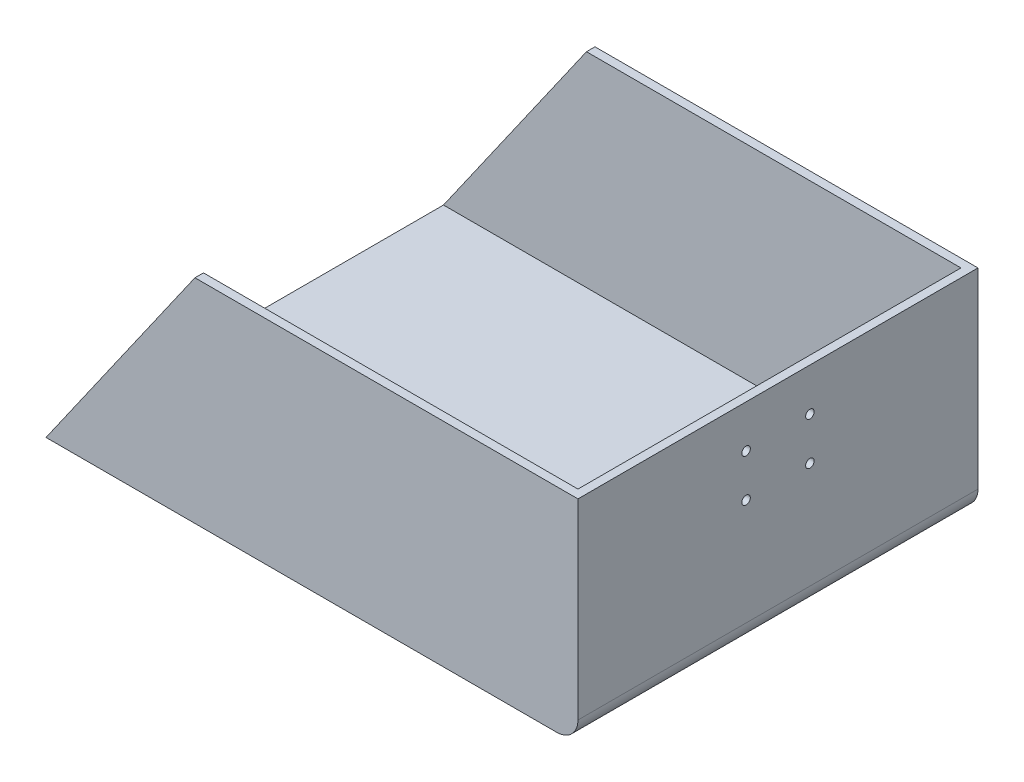
ISO-10303-21;
HEADER;
FILE_DESCRIPTION(('STEP AP214'),'2;1');
FILE_NAME('part.step','',(''),(''),'','','');
FILE_SCHEMA(('AUTOMOTIVE_DESIGN { 1 0 10303 214 1 1 1 1 }'));
ENDSEC;
DATA;
#1=APPLICATION_CONTEXT('core data for automotive mechanical design processes');
#2=APPLICATION_PROTOCOL_DEFINITION('international standard','automotive_design',2000,#1);
#3=PRODUCT_CONTEXT('',#1,'mechanical');
#4=PRODUCT('Part','Part','',(#3));
#5=PRODUCT_RELATED_PRODUCT_CATEGORY('part','',(#4));
#6=PRODUCT_DEFINITION_FORMATION('','',#4);
#7=PRODUCT_DEFINITION_CONTEXT('part definition',#1,'design');
#8=PRODUCT_DEFINITION('design','',#6,#7);
#9=PRODUCT_DEFINITION_SHAPE('','',#8);
#10=(LENGTH_UNIT() NAMED_UNIT(*) SI_UNIT(.MILLI.,.METRE.));
#11=(NAMED_UNIT(*) PLANE_ANGLE_UNIT() SI_UNIT($,.RADIAN.));
#12=(NAMED_UNIT(*) SI_UNIT($,.STERADIAN.) SOLID_ANGLE_UNIT());
#13=UNCERTAINTY_MEASURE_WITH_UNIT(LENGTH_MEASURE(1.E-05),#10,'distance_accuracy_value','');
#14=(GEOMETRIC_REPRESENTATION_CONTEXT(3) GLOBAL_UNCERTAINTY_ASSIGNED_CONTEXT((#13)) GLOBAL_UNIT_ASSIGNED_CONTEXT((#10,
#11,#12)) REPRESENTATION_CONTEXT('',''));
#15=CARTESIAN_POINT('',(0.,0.,0.));
#16=DIRECTION('',(0.,0.,1.));
#17=DIRECTION('',(1.,0.,0.));
#18=AXIS2_PLACEMENT_3D('',#15,#16,#17);
#19=CARTESIAN_POINT('',(-180.,100.,188.));
#20=DIRECTION('',(0.81923192051904,-0.573462344363328,0.));
#21=DIRECTION('',(0.573462344363328,0.81923192051904,0.));
#22=AXIS2_PLACEMENT_3D('',#19,#20,#21);
#23=PLANE('',#22);
#24=DIRECTION('',(-0.573462344363328,-0.81923192051904,0.));
#25=VECTOR('',#24,1.);
#26=CARTESIAN_POINT('',(-166.375838926175,119.463087248322,4.));
#27=LINE('',#26,#25);
#28=CARTESIAN_POINT('',(-180.,100.,4.));
#29=VERTEX_POINT('',#28);
#30=CARTESIAN_POINT('',(-247.2,3.99999999999997,4.));
#31=VERTEX_POINT('',#30);
#32=EDGE_CURVE('E178',#29,#31,#27,.T.);
#33=ORIENTED_EDGE('',*,*,#32,.F.);
#34=DIRECTION('',(0.,0.,-1.));
#35=VECTOR('',#34,1.);
#36=CARTESIAN_POINT('',(-180.,100.,188.));
#37=LINE('',#36,#35);
#38=CARTESIAN_POINT('',(-180.,100.,0.));
#39=VERTEX_POINT('',#38);
#40=EDGE_CURVE('E96',#29,#39,#37,.T.);
#41=ORIENTED_EDGE('',*,*,#40,.T.);
#42=DIRECTION('',(-0.573462344363328,-0.81923192051904,0.));
#43=VECTOR('',#42,1.);
#44=CARTESIAN_POINT('',(-180.,100.,0.));
#45=LINE('',#44,#43);
#46=CARTESIAN_POINT('',(-250.,0.,0.));
#47=VERTEX_POINT('',#46);
#48=EDGE_CURVE('E139',#39,#47,#45,.T.);
#49=ORIENTED_EDGE('',*,*,#48,.T.);
#50=DIRECTION('',(0.,0.,-1.));
#51=VECTOR('',#50,1.);
#52=CARTESIAN_POINT('',(-250.,0.,188.));
#53=LINE('',#52,#51);
#54=CARTESIAN_POINT('',(-250.,0.,188.));
#55=VERTEX_POINT('',#54);
#56=EDGE_CURVE('E11',#55,#47,#53,.T.);
#57=ORIENTED_EDGE('',*,*,#56,.F.);
#58=DIRECTION('',(-0.573462344363328,-0.81923192051904,0.));
#59=VECTOR('',#58,1.);
#60=CARTESIAN_POINT('',(-180.,100.,188.));
#61=LINE('',#60,#59);
#62=CARTESIAN_POINT('',(-180.,100.,188.));
#63=VERTEX_POINT('',#62);
#64=EDGE_CURVE('E154',#63,#55,#61,.T.);
#65=ORIENTED_EDGE('',*,*,#64,.F.);
#66=CARTESIAN_POINT('',(-180.,100.,184.));
#67=VERTEX_POINT('',#66);
#68=EDGE_CURVE('E155',#63,#67,#37,.T.);
#69=ORIENTED_EDGE('',*,*,#68,.T.);
#70=DIRECTION('',(-0.573462344363328,-0.81923192051904,0.));
#71=VECTOR('',#70,1.);
#72=CARTESIAN_POINT('',(-166.375838926175,119.463087248322,184.));
#73=LINE('',#72,#71);
#74=CARTESIAN_POINT('',(-247.2,3.99999999999997,184.));
#75=VERTEX_POINT('',#74);
#76=EDGE_CURVE('E224',#67,#75,#73,.T.);
#77=ORIENTED_EDGE('',*,*,#76,.T.);
#78=DIRECTION('',(0.,0.,-1.));
#79=VECTOR('',#78,1.);
#80=CARTESIAN_POINT('',(-247.2,3.99999999999997,188.));
#81=LINE('',#80,#79);
#82=EDGE_CURVE('E143',#75,#31,#81,.T.);
#83=ORIENTED_EDGE('',*,*,#82,.T.);
#84=EDGE_LOOP('',(#33,#41,#49,#57,#65,#69,#77,#83));
#85=FACE_BOUND('',#84,.T.);
#86=ADVANCED_FACE('F45',(#85),#23,.F.);
#87=CARTESIAN_POINT('',(0.,100.,188.));
#88=DIRECTION('',(0.,-1.,0.));
#89=DIRECTION('',(1.,0.,0.));
#90=AXIS2_PLACEMENT_3D('',#87,#88,#89);
#91=PLANE('',#90);
#92=DIRECTION('',(-1.,0.,0.));
#93=VECTOR('',#92,1.);
#94=CARTESIAN_POINT('',(-10.,100.,4.));
#95=LINE('',#94,#93);
#96=CARTESIAN_POINT('',(-4.,100.,4.));
#97=VERTEX_POINT('',#96);
#98=EDGE_CURVE('E194',#97,#29,#95,.T.);
#99=ORIENTED_EDGE('',*,*,#98,.F.);
#100=DIRECTION('',(0.,0.,-1.));
#101=VECTOR('',#100,1.);
#102=CARTESIAN_POINT('',(-4.,100.,188.));
#103=LINE('',#102,#101);
#104=CARTESIAN_POINT('',(-4.,100.,184.));
#105=VERTEX_POINT('',#104);
#106=EDGE_CURVE('E208',#105,#97,#103,.T.);
#107=ORIENTED_EDGE('',*,*,#106,.F.);
#108=DIRECTION('',(-1.,0.,0.));
#109=VECTOR('',#108,1.);
#110=CARTESIAN_POINT('',(-10.,100.,184.));
#111=LINE('',#110,#109);
#112=EDGE_CURVE('E62',#105,#67,#111,.T.);
#113=ORIENTED_EDGE('',*,*,#112,.T.);
#114=ORIENTED_EDGE('',*,*,#68,.F.);
#115=DIRECTION('',(-1.,0.,0.));
#116=VECTOR('',#115,1.);
#117=CARTESIAN_POINT('',(0.,100.,188.));
#118=LINE('',#117,#116);
#119=CARTESIAN_POINT('',(0.,100.,188.));
#120=VERTEX_POINT('',#119);
#121=EDGE_CURVE('E71',#120,#63,#118,.T.);
#122=ORIENTED_EDGE('',*,*,#121,.F.);
#123=DIRECTION('',(0.,0.,-1.));
#124=VECTOR('',#123,1.);
#125=CARTESIAN_POINT('',(0.,100.,188.));
#126=LINE('',#125,#124);
#127=CARTESIAN_POINT('',(0.,100.,0.));
#128=VERTEX_POINT('',#127);
#129=EDGE_CURVE('E129',#120,#128,#126,.T.);
#130=ORIENTED_EDGE('',*,*,#129,.T.);
#131=DIRECTION('',(-1.,0.,0.));
#132=VECTOR('',#131,1.);
#133=CARTESIAN_POINT('',(0.,100.,0.));
#134=LINE('',#133,#132);
#135=EDGE_CURVE('E151',#128,#39,#134,.T.);
#136=ORIENTED_EDGE('',*,*,#135,.T.);
#137=ORIENTED_EDGE('',*,*,#40,.F.);
#138=EDGE_LOOP('',(#99,#107,#113,#114,#122,#130,#136,#137));
#139=FACE_BOUND('',#138,.T.);
#140=ADVANCED_FACE('F281',(#139),#91,.F.);
#141=CARTESIAN_POINT('',(-10.0000000000001,0.,188.));
#142=DIRECTION('',(0.,1.,0.));
#143=DIRECTION('',(-1.,0.,0.));
#144=AXIS2_PLACEMENT_3D('',#141,#142,#143);
#145=PLANE('',#144);
#146=DIRECTION('',(1.,0.,0.));
#147=VECTOR('',#146,1.);
#148=CARTESIAN_POINT('',(-10.0000000000001,0.,0.));
#149=LINE('',#148,#147);
#150=CARTESIAN_POINT('',(-10.0000000000001,0.,0.));
#151=VERTEX_POINT('',#150);
#152=EDGE_CURVE('E142',#47,#151,#149,.T.);
#153=ORIENTED_EDGE('',*,*,#152,.T.);
#154=DIRECTION('',(0.,0.,-1.));
#155=VECTOR('',#154,1.);
#156=CARTESIAN_POINT('',(-10.0000000000001,0.,188.));
#157=LINE('',#156,#155);
#158=CARTESIAN_POINT('',(-10.0000000000001,0.,188.));
#159=VERTEX_POINT('',#158);
#160=EDGE_CURVE('E54',#159,#151,#157,.T.);
#161=ORIENTED_EDGE('',*,*,#160,.F.);
#162=DIRECTION('',(1.,0.,0.));
#163=VECTOR('',#162,1.);
#164=CARTESIAN_POINT('',(-10.0000000000001,0.,188.));
#165=LINE('',#164,#163);
#166=EDGE_CURVE('E104',#55,#159,#165,.T.);
#167=ORIENTED_EDGE('',*,*,#166,.F.);
#168=ORIENTED_EDGE('',*,*,#56,.T.);
#169=EDGE_LOOP('',(#153,#161,#167,#168));
#170=FACE_BOUND('',#169,.T.);
#171=ADVANCED_FACE('F286',(#170),#145,.F.);
#172=CARTESIAN_POINT('',(-10.,10.,188.));
#173=DIRECTION('',(0.,0.,-1.));
#174=DIRECTION('',(-1.,0.,0.));
#175=AXIS2_PLACEMENT_3D('',#172,#173,#174);
#176=CYLINDRICAL_SURFACE('',#175,10.);
#177=CARTESIAN_POINT('',(-10.,10.,0.));
#178=DIRECTION('',(0.,0.,1.));
#179=DIRECTION('',(-1.,0.,0.));
#180=AXIS2_PLACEMENT_3D('',#177,#178,#179);
#181=CIRCLE('',#180,10.);
#182=CARTESIAN_POINT('',(0.,10.0000000000001,0.));
#183=VERTEX_POINT('',#182);
#184=EDGE_CURVE('E125',#151,#183,#181,.T.);
#185=ORIENTED_EDGE('',*,*,#184,.T.);
#186=DIRECTION('',(0.,0.,-1.));
#187=VECTOR('',#186,1.);
#188=CARTESIAN_POINT('',(0.,10.0000000000001,188.));
#189=LINE('',#188,#187);
#190=CARTESIAN_POINT('',(0.,10.0000000000001,188.));
#191=VERTEX_POINT('',#190);
#192=EDGE_CURVE('E122',#191,#183,#189,.T.);
#193=ORIENTED_EDGE('',*,*,#192,.F.);
#194=CARTESIAN_POINT('',(-10.,10.,188.));
#195=DIRECTION('',(0.,0.,1.));
#196=DIRECTION('',(-1.,0.,0.));
#197=AXIS2_PLACEMENT_3D('',#194,#195,#196);
#198=CIRCLE('',#197,10.);
#199=EDGE_CURVE('E111',#159,#191,#198,.T.);
#200=ORIENTED_EDGE('',*,*,#199,.F.);
#201=ORIENTED_EDGE('',*,*,#160,.T.);
#202=EDGE_LOOP('',(#185,#193,#200,#201));
#203=FACE_BOUND('',#202,.T.);
#204=ADVANCED_FACE('F123',(#203),#176,.T.);
#205=CARTESIAN_POINT('',(0.,10.0000000000001,188.));
#206=DIRECTION('',(-1.,0.,0.));
#207=DIRECTION('',(0.,0.,1.));
#208=AXIS2_PLACEMENT_3D('',#205,#206,#207);
#209=PLANE('',#208);
#210=CARTESIAN_POINT('',(0.,60.,109.));
#211=DIRECTION('',(1.,0.,0.));
#212=DIRECTION('',(0.,0.,-1.));
#213=AXIS2_PLACEMENT_3D('',#210,#211,#212);
#214=CIRCLE('',#213,2.);
#215=CARTESIAN_POINT('',(0.,60.,107.));
#216=VERTEX_POINT('',#215);
#217=EDGE_CURVE('E243',#216,#216,#214,.T.);
#218=ORIENTED_EDGE('',*,*,#217,.F.);
#219=EDGE_LOOP('',(#218));
#220=FACE_BOUND('',#219,.T.);
#221=CARTESIAN_POINT('',(0.,60.,78.9999999999995));
#222=DIRECTION('',(1.,0.,0.));
#223=DIRECTION('',(0.,0.,-1.));
#224=AXIS2_PLACEMENT_3D('',#221,#222,#223);
#225=CIRCLE('',#224,2.);
#226=CARTESIAN_POINT('',(0.,60.,76.9999999999995));
#227=VERTEX_POINT('',#226);
#228=EDGE_CURVE('E247',#227,#227,#225,.T.);
#229=ORIENTED_EDGE('',*,*,#228,.F.);
#230=EDGE_LOOP('',(#229));
#231=FACE_BOUND('',#230,.T.);
#232=CARTESIAN_POINT('',(0.,80.,79.));
#233=DIRECTION('',(1.,0.,0.));
#234=DIRECTION('',(0.,0.,-1.));
#235=AXIS2_PLACEMENT_3D('',#232,#233,#234);
#236=CIRCLE('',#235,2.);
#237=CARTESIAN_POINT('',(0.,80.,77.));
#238=VERTEX_POINT('',#237);
#239=EDGE_CURVE('E242',#238,#238,#236,.T.);
#240=ORIENTED_EDGE('',*,*,#239,.F.);
#241=EDGE_LOOP('',(#240));
#242=FACE_BOUND('',#241,.T.);
#243=CARTESIAN_POINT('',(0.,80.,109.));
#244=DIRECTION('',(1.,0.,0.));
#245=DIRECTION('',(0.,0.,-1.));
#246=AXIS2_PLACEMENT_3D('',#243,#244,#245);
#247=CIRCLE('',#246,2.);
#248=CARTESIAN_POINT('',(0.,80.,107.));
#249=VERTEX_POINT('',#248);
#250=EDGE_CURVE('E168',#249,#249,#247,.T.);
#251=ORIENTED_EDGE('',*,*,#250,.F.);
#252=EDGE_LOOP('',(#251));
#253=FACE_BOUND('',#252,.T.);
#254=DIRECTION('',(0.,1.,0.));
#255=VECTOR('',#254,1.);
#256=CARTESIAN_POINT('',(0.,10.0000000000001,0.));
#257=LINE('',#256,#255);
#258=EDGE_CURVE('E148',#183,#128,#257,.T.);
#259=ORIENTED_EDGE('',*,*,#258,.T.);
#260=ORIENTED_EDGE('',*,*,#129,.F.);
#261=DIRECTION('',(0.,1.,0.));
#262=VECTOR('',#261,1.);
#263=CARTESIAN_POINT('',(0.,10.0000000000001,188.));
#264=LINE('',#263,#262);
#265=EDGE_CURVE('E115',#191,#120,#264,.T.);
#266=ORIENTED_EDGE('',*,*,#265,.F.);
#267=ORIENTED_EDGE('',*,*,#192,.T.);
#268=EDGE_LOOP('',(#259,#260,#266,#267));
#269=FACE_BOUND('',#268,.T.);
#270=ADVANCED_FACE('F131',(#220,#231,#242,#253,#269),#209,.F.);
#271=CARTESIAN_POINT('',(-10.,10.,188.));
#272=DIRECTION('',(0.,0.,-1.));
#273=DIRECTION('',(-1.,0.,0.));
#274=AXIS2_PLACEMENT_3D('',#271,#272,#273);
#275=PLANE('',#274);
#276=ORIENTED_EDGE('',*,*,#64,.T.);
#277=ORIENTED_EDGE('',*,*,#166,.T.);
#278=ORIENTED_EDGE('',*,*,#199,.T.);
#279=ORIENTED_EDGE('',*,*,#265,.T.);
#280=ORIENTED_EDGE('',*,*,#121,.T.);
#281=EDGE_LOOP('',(#276,#277,#278,#279,#280));
#282=FACE_BOUND('',#281,.T.);
#283=ADVANCED_FACE('F113',(#282),#275,.F.);
#284=CARTESIAN_POINT('',(-10.,10.,0.));
#285=DIRECTION('',(0.,0.,-1.));
#286=DIRECTION('',(-1.,0.,0.));
#287=AXIS2_PLACEMENT_3D('',#284,#285,#286);
#288=PLANE('',#287);
#289=ORIENTED_EDGE('',*,*,#48,.F.);
#290=ORIENTED_EDGE('',*,*,#135,.F.);
#291=ORIENTED_EDGE('',*,*,#258,.F.);
#292=ORIENTED_EDGE('',*,*,#184,.F.);
#293=ORIENTED_EDGE('',*,*,#152,.F.);
#294=EDGE_LOOP('',(#289,#290,#291,#292,#293));
#295=FACE_BOUND('',#294,.T.);
#296=ADVANCED_FACE('F299',(#295),#288,.T.);
#297=CARTESIAN_POINT('',(-10.0000000000001,4.,188.));
#298=DIRECTION('',(0.,1.,0.));
#299=DIRECTION('',(-1.,0.,0.));
#300=AXIS2_PLACEMENT_3D('',#297,#298,#299);
#301=PLANE('',#300);
#302=DIRECTION('',(1.,0.,0.));
#303=VECTOR('',#302,1.);
#304=CARTESIAN_POINT('',(-10.,4.,4.));
#305=LINE('',#304,#303);
#306=CARTESIAN_POINT('',(-10.,4.,4.));
#307=VERTEX_POINT('',#306);
#308=EDGE_CURVE('E183',#31,#307,#305,.T.);
#309=ORIENTED_EDGE('',*,*,#308,.F.);
#310=ORIENTED_EDGE('',*,*,#82,.F.);
#311=DIRECTION('',(1.,0.,0.));
#312=VECTOR('',#311,1.);
#313=CARTESIAN_POINT('',(-10.,4.,184.));
#314=LINE('',#313,#312);
#315=CARTESIAN_POINT('',(-10.,4.,184.));
#316=VERTEX_POINT('',#315);
#317=EDGE_CURVE('E220',#75,#316,#314,.T.);
#318=ORIENTED_EDGE('',*,*,#317,.T.);
#319=DIRECTION('',(0.,0.,-1.));
#320=VECTOR('',#319,1.);
#321=CARTESIAN_POINT('',(-10.,4.,188.));
#322=LINE('',#321,#320);
#323=EDGE_CURVE('E200',#316,#307,#322,.T.);
#324=ORIENTED_EDGE('',*,*,#323,.T.);
#325=EDGE_LOOP('',(#309,#310,#318,#324));
#326=FACE_BOUND('',#325,.T.);
#327=ADVANCED_FACE('F309',(#326),#301,.T.);
#328=CARTESIAN_POINT('',(-10.,10.,188.));
#329=DIRECTION('',(0.,0.,-1.));
#330=DIRECTION('',(-1.,0.,0.));
#331=AXIS2_PLACEMENT_3D('',#328,#329,#330);
#332=CYLINDRICAL_SURFACE('',#331,6.);
#333=CARTESIAN_POINT('',(-10.,10.,4.));
#334=DIRECTION('',(0.,0.,-1.));
#335=DIRECTION('',(-1.,0.,0.));
#336=AXIS2_PLACEMENT_3D('',#333,#334,#335);
#337=CIRCLE('',#336,6.);
#338=CARTESIAN_POINT('',(-4.,10.0000000000001,4.));
#339=VERTEX_POINT('',#338);
#340=EDGE_CURVE('E190',#307,#339,#337,.F.);
#341=ORIENTED_EDGE('',*,*,#340,.F.);
#342=ORIENTED_EDGE('',*,*,#323,.F.);
#343=CARTESIAN_POINT('',(-10.,10.,184.));
#344=DIRECTION('',(0.,0.,-1.));
#345=DIRECTION('',(-1.,0.,0.));
#346=AXIS2_PLACEMENT_3D('',#343,#344,#345);
#347=CIRCLE('',#346,6.);
#348=CARTESIAN_POINT('',(-4.,10.0000000000001,184.));
#349=VERTEX_POINT('',#348);
#350=EDGE_CURVE('E216',#316,#349,#347,.F.);
#351=ORIENTED_EDGE('',*,*,#350,.T.);
#352=DIRECTION('',(0.,0.,1.));
#353=VECTOR('',#352,1.);
#354=CARTESIAN_POINT('',(-4.,10.0000000000001,188.));
#355=LINE('',#354,#353);
#356=EDGE_CURVE('E204',#349,#339,#355,.F.);
#357=ORIENTED_EDGE('',*,*,#356,.T.);
#358=EDGE_LOOP('',(#341,#342,#351,#357));
#359=FACE_BOUND('',#358,.T.);
#360=ADVANCED_FACE('F316',(#359),#332,.F.);
#361=CARTESIAN_POINT('',(-4.,10.0000000000001,188.));
#362=DIRECTION('',(-1.,0.,0.));
#363=DIRECTION('',(0.,0.,1.));
#364=AXIS2_PLACEMENT_3D('',#361,#362,#363);
#365=PLANE('',#364);
#366=CARTESIAN_POINT('',(-4.,60.,109.));
#367=DIRECTION('',(-1.,0.,0.));
#368=DIRECTION('',(0.,0.,1.));
#369=AXIS2_PLACEMENT_3D('',#366,#367,#368);
#370=CIRCLE('',#369,2.);
#371=CARTESIAN_POINT('',(-4.,60.,111.));
#372=VERTEX_POINT('',#371);
#373=EDGE_CURVE('E48',#372,#372,#370,.T.);
#374=ORIENTED_EDGE('',*,*,#373,.F.);
#375=EDGE_LOOP('',(#374));
#376=FACE_BOUND('',#375,.T.);
#377=CARTESIAN_POINT('',(-4.,60.,78.9999999999995));
#378=DIRECTION('',(-1.,0.,0.));
#379=DIRECTION('',(0.,0.,1.));
#380=AXIS2_PLACEMENT_3D('',#377,#378,#379);
#381=CIRCLE('',#380,2.);
#382=CARTESIAN_POINT('',(-4.,60.,80.9999999999995));
#383=VERTEX_POINT('',#382);
#384=EDGE_CURVE('E171',#383,#383,#381,.T.);
#385=ORIENTED_EDGE('',*,*,#384,.F.);
#386=EDGE_LOOP('',(#385));
#387=FACE_BOUND('',#386,.T.);
#388=CARTESIAN_POINT('',(-4.,80.,79.));
#389=DIRECTION('',(-1.,0.,0.));
#390=DIRECTION('',(0.,0.,1.));
#391=AXIS2_PLACEMENT_3D('',#388,#389,#390);
#392=CIRCLE('',#391,2.);
#393=CARTESIAN_POINT('',(-4.,80.,81.));
#394=VERTEX_POINT('',#393);
#395=EDGE_CURVE('E167',#394,#394,#392,.T.);
#396=ORIENTED_EDGE('',*,*,#395,.F.);
#397=EDGE_LOOP('',(#396));
#398=FACE_BOUND('',#397,.T.);
#399=CARTESIAN_POINT('',(-4.,80.,109.));
#400=DIRECTION('',(-1.,0.,0.));
#401=DIRECTION('',(0.,0.,1.));
#402=AXIS2_PLACEMENT_3D('',#399,#400,#401);
#403=CIRCLE('',#402,2.);
#404=CARTESIAN_POINT('',(-4.,80.,111.));
#405=VERTEX_POINT('',#404);
#406=EDGE_CURVE('E163',#405,#405,#403,.T.);
#407=ORIENTED_EDGE('',*,*,#406,.F.);
#408=EDGE_LOOP('',(#407));
#409=FACE_BOUND('',#408,.T.);
#410=DIRECTION('',(0.,1.,0.));
#411=VECTOR('',#410,1.);
#412=CARTESIAN_POINT('',(-4.,10.,4.));
#413=LINE('',#412,#411);
#414=EDGE_CURVE('E230',#339,#97,#413,.T.);
#415=ORIENTED_EDGE('',*,*,#414,.F.);
#416=ORIENTED_EDGE('',*,*,#356,.F.);
#417=DIRECTION('',(0.,1.,0.));
#418=VECTOR('',#417,1.);
#419=CARTESIAN_POINT('',(-4.,10.,184.));
#420=LINE('',#419,#418);
#421=EDGE_CURVE('E213',#349,#105,#420,.T.);
#422=ORIENTED_EDGE('',*,*,#421,.T.);
#423=ORIENTED_EDGE('',*,*,#106,.T.);
#424=EDGE_LOOP('',(#415,#416,#422,#423));
#425=FACE_BOUND('',#424,.T.);
#426=ADVANCED_FACE('F314',(#376,#387,#398,#409,#425),#365,.T.);
#427=CARTESIAN_POINT('',(-10.,10.,184.));
#428=DIRECTION('',(0.,0.,-1.));
#429=DIRECTION('',(-1.,0.,0.));
#430=AXIS2_PLACEMENT_3D('',#427,#428,#429);
#431=PLANE('',#430);
#432=ORIENTED_EDGE('',*,*,#76,.F.);
#433=ORIENTED_EDGE('',*,*,#112,.F.);
#434=ORIENTED_EDGE('',*,*,#421,.F.);
#435=ORIENTED_EDGE('',*,*,#350,.F.);
#436=ORIENTED_EDGE('',*,*,#317,.F.);
#437=EDGE_LOOP('',(#432,#433,#434,#435,#436));
#438=FACE_BOUND('',#437,.T.);
#439=ADVANCED_FACE('F276',(#438),#431,.T.);
#440=CARTESIAN_POINT('',(-10.,10.,4.));
#441=DIRECTION('',(0.,0.,-1.));
#442=DIRECTION('',(-1.,0.,0.));
#443=AXIS2_PLACEMENT_3D('',#440,#441,#442);
#444=PLANE('',#443);
#445=ORIENTED_EDGE('',*,*,#32,.T.);
#446=ORIENTED_EDGE('',*,*,#308,.T.);
#447=ORIENTED_EDGE('',*,*,#340,.T.);
#448=ORIENTED_EDGE('',*,*,#414,.T.);
#449=ORIENTED_EDGE('',*,*,#98,.T.);
#450=EDGE_LOOP('',(#445,#446,#447,#448,#449));
#451=FACE_BOUND('',#450,.T.);
#452=ADVANCED_FACE('F265',(#451),#444,.F.);
#453=CARTESIAN_POINT('',(-120.,80.,109.));
#454=DIRECTION('',(1.,0.,0.));
#455=DIRECTION('',(0.,0.,-1.));
#456=AXIS2_PLACEMENT_3D('',#453,#454,#455);
#457=CYLINDRICAL_SURFACE('',#456,2.);
#458=ORIENTED_EDGE('',*,*,#406,.T.);
#459=EDGE_LOOP('',(#458));
#460=FACE_BOUND('',#459,.T.);
#461=ORIENTED_EDGE('',*,*,#250,.T.);
#462=EDGE_LOOP('',(#461));
#463=FACE_BOUND('',#462,.T.);
#464=ADVANCED_FACE('F263',(#460,#463),#457,.F.);
#465=CARTESIAN_POINT('',(-120.,80.,79.));
#466=DIRECTION('',(1.,0.,0.));
#467=DIRECTION('',(0.,0.,-1.));
#468=AXIS2_PLACEMENT_3D('',#465,#466,#467);
#469=CYLINDRICAL_SURFACE('',#468,2.);
#470=ORIENTED_EDGE('',*,*,#395,.T.);
#471=EDGE_LOOP('',(#470));
#472=FACE_BOUND('',#471,.T.);
#473=ORIENTED_EDGE('',*,*,#239,.T.);
#474=EDGE_LOOP('',(#473));
#475=FACE_BOUND('',#474,.T.);
#476=ADVANCED_FACE('F255',(#472,#475),#469,.F.);
#477=CARTESIAN_POINT('',(-120.,60.,78.9999999999995));
#478=DIRECTION('',(1.,0.,0.));
#479=DIRECTION('',(0.,0.,-1.));
#480=AXIS2_PLACEMENT_3D('',#477,#478,#479);
#481=CYLINDRICAL_SURFACE('',#480,2.);
#482=ORIENTED_EDGE('',*,*,#384,.T.);
#483=EDGE_LOOP('',(#482));
#484=FACE_BOUND('',#483,.T.);
#485=ORIENTED_EDGE('',*,*,#228,.T.);
#486=EDGE_LOOP('',(#485));
#487=FACE_BOUND('',#486,.T.);
#488=ADVANCED_FACE('F272',(#484,#487),#481,.F.);
#489=CARTESIAN_POINT('',(-120.,60.,109.));
#490=DIRECTION('',(1.,0.,0.));
#491=DIRECTION('',(0.,0.,-1.));
#492=AXIS2_PLACEMENT_3D('',#489,#490,#491);
#493=CYLINDRICAL_SURFACE('',#492,2.);
#494=ORIENTED_EDGE('',*,*,#373,.T.);
#495=EDGE_LOOP('',(#494));
#496=FACE_BOUND('',#495,.T.);
#497=ORIENTED_EDGE('',*,*,#217,.T.);
#498=EDGE_LOOP('',(#497));
#499=FACE_BOUND('',#498,.T.);
#500=ADVANCED_FACE('F392',(#496,#499),#493,.F.);
#501=CLOSED_SHELL('',(#86,#140,#171,#204,#270,#283,#296,#327,#360,#426,#439,#452,#464,#476,#488,#500));
#502=MANIFOLD_SOLID_BREP('B2',#501);
#503=ADVANCED_BREP_SHAPE_REPRESENTATION('',(#18,#502),#14);
#504=SHAPE_DEFINITION_REPRESENTATION(#9,#503);
ENDSEC;
END-ISO-10303-21;
